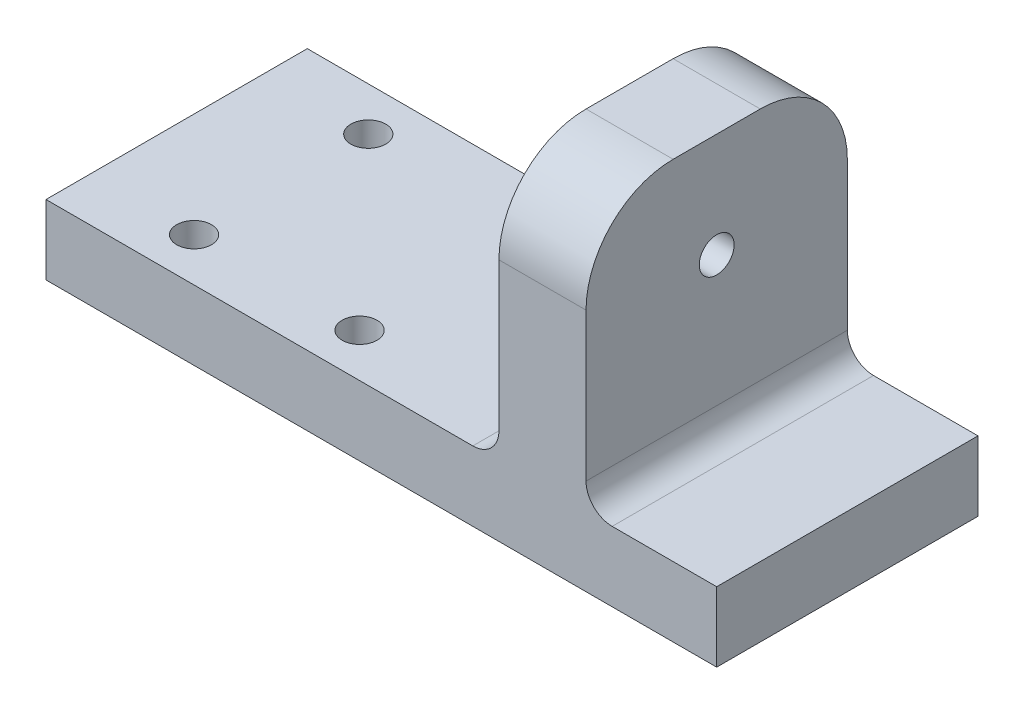
ISO-10303-21;
HEADER;
FILE_DESCRIPTION(('STEP AP214'),'2;1');
FILE_NAME('part.step','',(''),(''),'','','');
FILE_SCHEMA(('AUTOMOTIVE_DESIGN { 1 0 10303 214 1 1 1 1 }'));
ENDSEC;
DATA;
#1=APPLICATION_CONTEXT('core data for automotive mechanical design processes');
#2=APPLICATION_PROTOCOL_DEFINITION('international standard','automotive_design',2000,#1);
#3=PRODUCT_CONTEXT('',#1,'mechanical');
#4=PRODUCT('Part','Part','',(#3));
#5=PRODUCT_RELATED_PRODUCT_CATEGORY('part','',(#4));
#6=PRODUCT_DEFINITION_FORMATION('','',#4);
#7=PRODUCT_DEFINITION_CONTEXT('part definition',#1,'design');
#8=PRODUCT_DEFINITION('design','',#6,#7);
#9=PRODUCT_DEFINITION_SHAPE('','',#8);
#10=(LENGTH_UNIT() NAMED_UNIT(*) SI_UNIT(.MILLI.,.METRE.));
#11=(NAMED_UNIT(*) PLANE_ANGLE_UNIT() SI_UNIT($,.RADIAN.));
#12=(NAMED_UNIT(*) SI_UNIT($,.STERADIAN.) SOLID_ANGLE_UNIT());
#13=UNCERTAINTY_MEASURE_WITH_UNIT(LENGTH_MEASURE(1.E-05),#10,'distance_accuracy_value','');
#14=(GEOMETRIC_REPRESENTATION_CONTEXT(3) GLOBAL_UNCERTAINTY_ASSIGNED_CONTEXT((#13)) GLOBAL_UNIT_ASSIGNED_CONTEXT((#10,
#11,#12)) REPRESENTATION_CONTEXT('',''));
#15=CARTESIAN_POINT('',(0.,0.,0.));
#16=DIRECTION('',(0.,0.,1.));
#17=DIRECTION('',(1.,0.,0.));
#18=AXIS2_PLACEMENT_3D('',#15,#16,#17);
#19=CARTESIAN_POINT('',(0.,8.,0.));
#20=DIRECTION('',(0.,1.,0.));
#21=DIRECTION('',(0.,0.,1.));
#22=AXIS2_PLACEMENT_3D('',#19,#20,#21);
#23=PLANE('',#22);
#24=DIRECTION('',(-1.,0.,0.));
#25=VECTOR('',#24,1.);
#26=CARTESIAN_POINT('',(-20.,8.,-15.));
#27=LINE('',#26,#25);
#28=CARTESIAN_POINT('',(20.,8.,-15.));
#29=VERTEX_POINT('',#28);
#30=CARTESIAN_POINT('',(8.,8.,-15.));
#31=VERTEX_POINT('',#30);
#32=EDGE_CURVE('E205',#29,#31,#27,.T.);
#33=ORIENTED_EDGE('',*,*,#32,.T.);
#34=DIRECTION('',(0.,0.,-1.));
#35=VECTOR('',#34,1.);
#36=CARTESIAN_POINT('',(8.,8.,0.));
#37=LINE('',#36,#35);
#38=CARTESIAN_POINT('',(8.,8.,15.));
#39=VERTEX_POINT('',#38);
#40=EDGE_CURVE('E235',#31,#39,#37,.F.);
#41=ORIENTED_EDGE('',*,*,#40,.T.);
#42=DIRECTION('',(1.,0.,0.));
#43=VECTOR('',#42,1.);
#44=CARTESIAN_POINT('',(-20.,8.,15.));
#45=LINE('',#44,#43);
#46=CARTESIAN_POINT('',(20.,8.,15.));
#47=VERTEX_POINT('',#46);
#48=EDGE_CURVE('E209',#39,#47,#45,.T.);
#49=ORIENTED_EDGE('',*,*,#48,.T.);
#50=DIRECTION('',(0.,0.,-1.));
#51=VECTOR('',#50,1.);
#52=CARTESIAN_POINT('',(20.,8.,-15.));
#53=LINE('',#52,#51);
#54=EDGE_CURVE('E200',#47,#29,#53,.T.);
#55=ORIENTED_EDGE('',*,*,#54,.T.);
#56=EDGE_LOOP('',(#33,#41,#49,#55));
#57=FACE_BOUND('',#56,.T.);
#58=ADVANCED_FACE('F39',(#57),#23,.T.);
#59=CARTESIAN_POINT('',(20.,8.,-15.));
#60=DIRECTION('',(-1.,0.,0.));
#61=DIRECTION('',(0.,0.,1.));
#62=AXIS2_PLACEMENT_3D('',#59,#60,#61);
#63=PLANE('',#62);
#64=DIRECTION('',(0.,0.,-1.));
#65=VECTOR('',#64,1.);
#66=CARTESIAN_POINT('',(20.,0.,-15.));
#67=LINE('',#66,#65);
#68=CARTESIAN_POINT('',(20.,0.,15.));
#69=VERTEX_POINT('',#68);
#70=CARTESIAN_POINT('',(20.,0.,-15.));
#71=VERTEX_POINT('',#70);
#72=EDGE_CURVE('E144',#69,#71,#67,.T.);
#73=ORIENTED_EDGE('',*,*,#72,.T.);
#74=DIRECTION('',(0.,-1.,0.));
#75=VECTOR('',#74,1.);
#76=CARTESIAN_POINT('',(20.,8.,-15.));
#77=LINE('',#76,#75);
#78=EDGE_CURVE('E138',#29,#71,#77,.T.);
#79=ORIENTED_EDGE('',*,*,#78,.F.);
#80=ORIENTED_EDGE('',*,*,#54,.F.);
#81=DIRECTION('',(0.,-1.,0.));
#82=VECTOR('',#81,1.);
#83=CARTESIAN_POINT('',(20.,8.,15.));
#84=LINE('',#83,#82);
#85=EDGE_CURVE('E214',#47,#69,#84,.T.);
#86=ORIENTED_EDGE('',*,*,#85,.T.);
#87=EDGE_LOOP('',(#73,#79,#80,#86));
#88=FACE_BOUND('',#87,.T.);
#89=ADVANCED_FACE('F302',(#88),#63,.F.);
#90=CARTESIAN_POINT('',(-20.,8.,-15.));
#91=DIRECTION('',(0.,0.,1.));
#92=DIRECTION('',(1.,0.,0.));
#93=AXIS2_PLACEMENT_3D('',#90,#91,#92);
#94=PLANE('',#93);
#95=DIRECTION('',(0.,-1.,0.));
#96=VECTOR('',#95,1.);
#97=CARTESIAN_POINT('',(-5.,38.,-15.));
#98=LINE('',#97,#96);
#99=CARTESIAN_POINT('',(-5.,28.,-15.));
#100=VERTEX_POINT('',#99);
#101=CARTESIAN_POINT('',(-5.,11.,-15.));
#102=VERTEX_POINT('',#101);
#103=EDGE_CURVE('E194',#100,#102,#98,.T.);
#104=ORIENTED_EDGE('',*,*,#103,.F.);
#105=DIRECTION('',(-1.,0.,0.));
#106=VECTOR('',#105,1.);
#107=CARTESIAN_POINT('',(5.,28.,-15.));
#108=LINE('',#107,#106);
#109=CARTESIAN_POINT('',(5.,28.,-15.));
#110=VERTEX_POINT('',#109);
#111=EDGE_CURVE('E11',#100,#110,#108,.F.);
#112=ORIENTED_EDGE('',*,*,#111,.T.);
#113=DIRECTION('',(0.,-1.,0.));
#114=VECTOR('',#113,1.);
#115=CARTESIAN_POINT('',(5.,38.,-15.));
#116=LINE('',#115,#114);
#117=CARTESIAN_POINT('',(5.,11.,-15.));
#118=VERTEX_POINT('',#117);
#119=EDGE_CURVE('E197',#110,#118,#116,.T.);
#120=ORIENTED_EDGE('',*,*,#119,.T.);
#121=CARTESIAN_POINT('',(8.,11.,-15.));
#122=DIRECTION('',(0.,0.,1.));
#123=DIRECTION('',(1.,0.,0.));
#124=AXIS2_PLACEMENT_3D('',#121,#122,#123);
#125=CIRCLE('',#124,3.);
#126=EDGE_CURVE('E245',#118,#31,#125,.T.);
#127=ORIENTED_EDGE('',*,*,#126,.T.);
#128=ORIENTED_EDGE('',*,*,#32,.F.);
#129=ORIENTED_EDGE('',*,*,#78,.T.);
#130=DIRECTION('',(-1.,0.,0.));
#131=VECTOR('',#130,1.);
#132=CARTESIAN_POINT('',(-20.,0.,-15.));
#133=LINE('',#132,#131);
#134=CARTESIAN_POINT('',(-57.,0.,-15.));
#135=VERTEX_POINT('',#134);
#136=EDGE_CURVE('E131',#71,#135,#133,.T.);
#137=ORIENTED_EDGE('',*,*,#136,.T.);
#138=DIRECTION('',(0.,-1.,0.));
#139=VECTOR('',#138,1.);
#140=CARTESIAN_POINT('',(-57.,8.,-15.));
#141=LINE('',#140,#139);
#142=CARTESIAN_POINT('',(-57.,8.,-15.));
#143=VERTEX_POINT('',#142);
#144=EDGE_CURVE('E136',#143,#135,#141,.T.);
#145=ORIENTED_EDGE('',*,*,#144,.F.);
#146=CARTESIAN_POINT('',(-8.,8.,-15.));
#147=VERTEX_POINT('',#146);
#148=EDGE_CURVE('E204',#147,#143,#27,.T.);
#149=ORIENTED_EDGE('',*,*,#148,.F.);
#150=CARTESIAN_POINT('',(-8.,11.,-15.));
#151=DIRECTION('',(0.,0.,1.));
#152=DIRECTION('',(1.,0.,0.));
#153=AXIS2_PLACEMENT_3D('',#150,#151,#152);
#154=CIRCLE('',#153,3.);
#155=EDGE_CURVE('E241',#147,#102,#154,.T.);
#156=ORIENTED_EDGE('',*,*,#155,.T.);
#157=EDGE_LOOP('',(#104,#112,#120,#127,#128,#129,#137,#145,#149,#156));
#158=FACE_BOUND('',#157,.T.);
#159=ADVANCED_FACE('F133',(#158),#94,.F.);
#160=CARTESIAN_POINT('',(-20.,8.,15.));
#161=DIRECTION('',(0.,0.,-1.));
#162=DIRECTION('',(-1.,0.,0.));
#163=AXIS2_PLACEMENT_3D('',#160,#161,#162);
#164=PLANE('',#163);
#165=DIRECTION('',(0.,-1.,0.));
#166=VECTOR('',#165,1.);
#167=CARTESIAN_POINT('',(5.,38.,15.));
#168=LINE('',#167,#166);
#169=CARTESIAN_POINT('',(5.,28.,15.));
#170=VERTEX_POINT('',#169);
#171=CARTESIAN_POINT('',(5.,11.,15.));
#172=VERTEX_POINT('',#171);
#173=EDGE_CURVE('E188',#170,#172,#168,.T.);
#174=ORIENTED_EDGE('',*,*,#173,.F.);
#175=DIRECTION('',(1.,0.,0.));
#176=VECTOR('',#175,1.);
#177=CARTESIAN_POINT('',(-5.,28.,15.));
#178=LINE('',#177,#176);
#179=CARTESIAN_POINT('',(-5.,28.,15.));
#180=VERTEX_POINT('',#179);
#181=EDGE_CURVE('E65',#170,#180,#178,.F.);
#182=ORIENTED_EDGE('',*,*,#181,.T.);
#183=DIRECTION('',(0.,-1.,0.));
#184=VECTOR('',#183,1.);
#185=CARTESIAN_POINT('',(-5.,38.,15.));
#186=LINE('',#185,#184);
#187=CARTESIAN_POINT('',(-5.,11.,15.));
#188=VERTEX_POINT('',#187);
#189=EDGE_CURVE('E191',#180,#188,#186,.T.);
#190=ORIENTED_EDGE('',*,*,#189,.T.);
#191=CARTESIAN_POINT('',(-8.,11.,15.));
#192=DIRECTION('',(0.,0.,-1.));
#193=DIRECTION('',(-1.,0.,0.));
#194=AXIS2_PLACEMENT_3D('',#191,#192,#193);
#195=CIRCLE('',#194,3.);
#196=CARTESIAN_POINT('',(-8.,8.,15.));
#197=VERTEX_POINT('',#196);
#198=EDGE_CURVE('E238',#188,#197,#195,.T.);
#199=ORIENTED_EDGE('',*,*,#198,.T.);
#200=CARTESIAN_POINT('',(-57.,8.,15.));
#201=VERTEX_POINT('',#200);
#202=EDGE_CURVE('E210',#201,#197,#45,.T.);
#203=ORIENTED_EDGE('',*,*,#202,.F.);
#204=DIRECTION('',(0.,1.,0.));
#205=VECTOR('',#204,1.);
#206=CARTESIAN_POINT('',(-57.,8.,15.));
#207=LINE('',#206,#205);
#208=CARTESIAN_POINT('',(-57.,0.,15.));
#209=VERTEX_POINT('',#208);
#210=EDGE_CURVE('E153',#209,#201,#207,.T.);
#211=ORIENTED_EDGE('',*,*,#210,.F.);
#212=DIRECTION('',(1.,0.,0.));
#213=VECTOR('',#212,1.);
#214=CARTESIAN_POINT('',(-20.,0.,15.));
#215=LINE('',#214,#213);
#216=EDGE_CURVE('E143',#209,#69,#215,.T.);
#217=ORIENTED_EDGE('',*,*,#216,.T.);
#218=ORIENTED_EDGE('',*,*,#85,.F.);
#219=ORIENTED_EDGE('',*,*,#48,.F.);
#220=CARTESIAN_POINT('',(8.,11.,15.));
#221=DIRECTION('',(0.,0.,-1.));
#222=DIRECTION('',(-1.,0.,0.));
#223=AXIS2_PLACEMENT_3D('',#220,#221,#222);
#224=CIRCLE('',#223,3.);
#225=EDGE_CURVE('E248',#39,#172,#224,.T.);
#226=ORIENTED_EDGE('',*,*,#225,.T.);
#227=EDGE_LOOP('',(#174,#182,#190,#199,#203,#211,#217,#218,#219,#226));
#228=FACE_BOUND('',#227,.T.);
#229=ADVANCED_FACE('F314',(#228),#164,.F.);
#230=CARTESIAN_POINT('',(-26.,8.,-10.));
#231=DIRECTION('',(0.,1.,0.));
#232=DIRECTION('',(0.,0.,-1.));
#233=AXIS2_PLACEMENT_3D('',#230,#231,#232);
#234=CIRCLE('',#233,2.);
#235=CARTESIAN_POINT('',(-26.,8.,-12.));
#236=VERTEX_POINT('',#235);
#237=EDGE_CURVE('E326',#236,#236,#234,.T.);
#238=ORIENTED_EDGE('',*,*,#237,.F.);
#239=EDGE_LOOP('',(#238));
#240=FACE_BOUND('',#239,.T.);
#241=CARTESIAN_POINT('',(-26.,8.,10.));
#242=DIRECTION('',(0.,1.,0.));
#243=DIRECTION('',(0.,0.,1.));
#244=AXIS2_PLACEMENT_3D('',#241,#242,#243);
#245=CIRCLE('',#244,2.);
#246=CARTESIAN_POINT('',(-26.,8.,12.));
#247=VERTEX_POINT('',#246);
#248=EDGE_CURVE('E329',#247,#247,#245,.T.);
#249=ORIENTED_EDGE('',*,*,#248,.F.);
#250=EDGE_LOOP('',(#249));
#251=FACE_BOUND('',#250,.T.);
#252=CARTESIAN_POINT('',(-45.,8.,10.));
#253=DIRECTION('',(0.,1.,0.));
#254=DIRECTION('',(0.,0.,-1.));
#255=AXIS2_PLACEMENT_3D('',#252,#253,#254);
#256=CIRCLE('',#255,2.);
#257=CARTESIAN_POINT('',(-45.,8.,8.));
#258=VERTEX_POINT('',#257);
#259=EDGE_CURVE('E333',#258,#258,#256,.T.);
#260=ORIENTED_EDGE('',*,*,#259,.F.);
#261=EDGE_LOOP('',(#260));
#262=FACE_BOUND('',#261,.T.);
#263=CARTESIAN_POINT('',(-45.,8.,-10.));
#264=DIRECTION('',(0.,1.,0.));
#265=DIRECTION('',(0.,0.,1.));
#266=AXIS2_PLACEMENT_3D('',#263,#264,#265);
#267=CIRCLE('',#266,2.);
#268=CARTESIAN_POINT('',(-45.,8.,-8.));
#269=VERTEX_POINT('',#268);
#270=EDGE_CURVE('E165',#269,#269,#267,.T.);
#271=ORIENTED_EDGE('',*,*,#270,.F.);
#272=EDGE_LOOP('',(#271));
#273=FACE_BOUND('',#272,.T.);
#274=ORIENTED_EDGE('',*,*,#202,.T.);
#275=DIRECTION('',(0.,0.,1.));
#276=VECTOR('',#275,1.);
#277=CARTESIAN_POINT('',(-8.,8.,0.));
#278=LINE('',#277,#276);
#279=EDGE_CURVE('E228',#197,#147,#278,.F.);
#280=ORIENTED_EDGE('',*,*,#279,.T.);
#281=ORIENTED_EDGE('',*,*,#148,.T.);
#282=DIRECTION('',(0.,0.,-1.));
#283=VECTOR('',#282,1.);
#284=CARTESIAN_POINT('',(-57.,8.,-15.));
#285=LINE('',#284,#283);
#286=EDGE_CURVE('E158',#201,#143,#285,.T.);
#287=ORIENTED_EDGE('',*,*,#286,.F.);
#288=EDGE_LOOP('',(#274,#280,#281,#287));
#289=FACE_BOUND('',#288,.T.);
#290=ADVANCED_FACE('F305',(#240,#251,#262,#273,#289),#23,.T.);
#291=CARTESIAN_POINT('',(0.,0.,0.));
#292=DIRECTION('',(0.,1.,0.));
#293=DIRECTION('',(0.,0.,1.));
#294=AXIS2_PLACEMENT_3D('',#291,#292,#293);
#295=PLANE('',#294);
#296=CARTESIAN_POINT('',(-26.,0.,-10.));
#297=DIRECTION('',(0.,1.,0.));
#298=DIRECTION('',(0.,0.,1.));
#299=AXIS2_PLACEMENT_3D('',#296,#297,#298);
#300=CIRCLE('',#299,2.);
#301=CARTESIAN_POINT('',(-26.,0.,-8.));
#302=VERTEX_POINT('',#301);
#303=EDGE_CURVE('E43',#302,#302,#300,.T.);
#304=ORIENTED_EDGE('',*,*,#303,.T.);
#305=EDGE_LOOP('',(#304));
#306=FACE_BOUND('',#305,.T.);
#307=CARTESIAN_POINT('',(-26.,0.,10.));
#308=DIRECTION('',(0.,1.,0.));
#309=DIRECTION('',(0.,0.,1.));
#310=AXIS2_PLACEMENT_3D('',#307,#308,#309);
#311=CIRCLE('',#310,2.);
#312=CARTESIAN_POINT('',(-26.,0.,12.));
#313=VERTEX_POINT('',#312);
#314=EDGE_CURVE('E163',#313,#313,#311,.T.);
#315=ORIENTED_EDGE('',*,*,#314,.T.);
#316=EDGE_LOOP('',(#315));
#317=FACE_BOUND('',#316,.T.);
#318=CARTESIAN_POINT('',(-45.,0.,10.));
#319=DIRECTION('',(0.,1.,0.));
#320=DIRECTION('',(0.,0.,1.));
#321=AXIS2_PLACEMENT_3D('',#318,#319,#320);
#322=CIRCLE('',#321,2.);
#323=CARTESIAN_POINT('',(-45.,0.,12.));
#324=VERTEX_POINT('',#323);
#325=EDGE_CURVE('E276',#324,#324,#322,.T.);
#326=ORIENTED_EDGE('',*,*,#325,.T.);
#327=EDGE_LOOP('',(#326));
#328=FACE_BOUND('',#327,.T.);
#329=CARTESIAN_POINT('',(-45.,0.,-10.));
#330=DIRECTION('',(0.,1.,0.));
#331=DIRECTION('',(0.,0.,1.));
#332=AXIS2_PLACEMENT_3D('',#329,#330,#331);
#333=CIRCLE('',#332,2.);
#334=CARTESIAN_POINT('',(-45.,0.,-8.));
#335=VERTEX_POINT('',#334);
#336=EDGE_CURVE('E272',#335,#335,#333,.T.);
#337=ORIENTED_EDGE('',*,*,#336,.T.);
#338=EDGE_LOOP('',(#337));
#339=FACE_BOUND('',#338,.T.);
#340=ORIENTED_EDGE('',*,*,#72,.F.);
#341=ORIENTED_EDGE('',*,*,#216,.F.);
#342=DIRECTION('',(0.,0.,1.));
#343=VECTOR('',#342,1.);
#344=CARTESIAN_POINT('',(-57.,0.,-15.));
#345=LINE('',#344,#343);
#346=EDGE_CURVE('E147',#135,#209,#345,.T.);
#347=ORIENTED_EDGE('',*,*,#346,.F.);
#348=ORIENTED_EDGE('',*,*,#136,.F.);
#349=EDGE_LOOP('',(#340,#341,#347,#348));
#350=FACE_BOUND('',#349,.T.);
#351=ADVANCED_FACE('F148',(#306,#317,#328,#339,#350),#295,.F.);
#352=CARTESIAN_POINT('',(5.,38.,-15.));
#353=DIRECTION('',(-1.,0.,0.));
#354=DIRECTION('',(0.,0.,1.));
#355=AXIS2_PLACEMENT_3D('',#352,#353,#354);
#356=PLANE('',#355);
#357=CARTESIAN_POINT('',(5.,26.,0.));
#358=DIRECTION('',(1.,0.,0.));
#359=DIRECTION('',(0.,0.,-1.));
#360=AXIS2_PLACEMENT_3D('',#357,#358,#359);
#361=CIRCLE('',#360,2.);
#362=CARTESIAN_POINT('',(5.,26.,-2.));
#363=VERTEX_POINT('',#362);
#364=EDGE_CURVE('E172',#363,#363,#361,.T.);
#365=ORIENTED_EDGE('',*,*,#364,.F.);
#366=EDGE_LOOP('',(#365));
#367=FACE_BOUND('',#366,.T.);
#368=DIRECTION('',(0.,0.,-1.));
#369=VECTOR('',#368,1.);
#370=CARTESIAN_POINT('',(5.,38.,-15.));
#371=LINE('',#370,#369);
#372=CARTESIAN_POINT('',(5.,38.,4.99999999999999));
#373=VERTEX_POINT('',#372);
#374=CARTESIAN_POINT('',(5.,38.,-5.00000000000001));
#375=VERTEX_POINT('',#374);
#376=EDGE_CURVE('E177',#373,#375,#371,.T.);
#377=ORIENTED_EDGE('',*,*,#376,.F.);
#378=CARTESIAN_POINT('',(5.,28.,4.99999999999999));
#379=DIRECTION('',(-1.,0.,0.));
#380=DIRECTION('',(0.,0.,1.));
#381=AXIS2_PLACEMENT_3D('',#378,#379,#380);
#382=CIRCLE('',#381,10.);
#383=EDGE_CURVE('E263',#373,#170,#382,.F.);
#384=ORIENTED_EDGE('',*,*,#383,.T.);
#385=ORIENTED_EDGE('',*,*,#173,.T.);
#386=DIRECTION('',(0.,0.,-1.));
#387=VECTOR('',#386,1.);
#388=CARTESIAN_POINT('',(5.,11.,-15.));
#389=LINE('',#388,#387);
#390=EDGE_CURVE('E231',#172,#118,#389,.T.);
#391=ORIENTED_EDGE('',*,*,#390,.T.);
#392=ORIENTED_EDGE('',*,*,#119,.F.);
#393=CARTESIAN_POINT('',(5.,28.,-5.));
#394=DIRECTION('',(-1.,0.,0.));
#395=DIRECTION('',(0.,0.,1.));
#396=AXIS2_PLACEMENT_3D('',#393,#394,#395);
#397=CIRCLE('',#396,10.);
#398=EDGE_CURVE('E260',#110,#375,#397,.F.);
#399=ORIENTED_EDGE('',*,*,#398,.T.);
#400=EDGE_LOOP('',(#377,#384,#385,#391,#392,#399));
#401=FACE_BOUND('',#400,.T.);
#402=ADVANCED_FACE('F320',(#367,#401),#356,.F.);
#403=CARTESIAN_POINT('',(-5.,38.,-15.));
#404=DIRECTION('',(1.,0.,0.));
#405=DIRECTION('',(0.,0.,-1.));
#406=AXIS2_PLACEMENT_3D('',#403,#404,#405);
#407=PLANE('',#406);
#408=CARTESIAN_POINT('',(-5.,26.,0.));
#409=DIRECTION('',(1.,0.,0.));
#410=DIRECTION('',(0.,0.,-1.));
#411=AXIS2_PLACEMENT_3D('',#408,#409,#410);
#412=CIRCLE('',#411,2.);
#413=CARTESIAN_POINT('',(-5.,26.,-2.));
#414=VERTEX_POINT('',#413);
#415=EDGE_CURVE('E173',#414,#414,#412,.T.);
#416=ORIENTED_EDGE('',*,*,#415,.T.);
#417=EDGE_LOOP('',(#416));
#418=FACE_BOUND('',#417,.T.);
#419=ORIENTED_EDGE('',*,*,#189,.F.);
#420=CARTESIAN_POINT('',(-5.,28.,4.99999999999999));
#421=DIRECTION('',(1.,0.,0.));
#422=DIRECTION('',(0.,0.,-1.));
#423=AXIS2_PLACEMENT_3D('',#420,#421,#422);
#424=CIRCLE('',#423,10.);
#425=CARTESIAN_POINT('',(-5.,38.,4.99999999999999));
#426=VERTEX_POINT('',#425);
#427=EDGE_CURVE('E49',#180,#426,#424,.F.);
#428=ORIENTED_EDGE('',*,*,#427,.T.);
#429=DIRECTION('',(0.,0.,1.));
#430=VECTOR('',#429,1.);
#431=CARTESIAN_POINT('',(-5.,38.,-15.));
#432=LINE('',#431,#430);
#433=CARTESIAN_POINT('',(-5.,38.,-5.00000000000001));
#434=VERTEX_POINT('',#433);
#435=EDGE_CURVE('E184',#434,#426,#432,.T.);
#436=ORIENTED_EDGE('',*,*,#435,.F.);
#437=CARTESIAN_POINT('',(-5.,28.,-5.));
#438=DIRECTION('',(1.,0.,0.));
#439=DIRECTION('',(0.,0.,-1.));
#440=AXIS2_PLACEMENT_3D('',#437,#438,#439);
#441=CIRCLE('',#440,10.);
#442=EDGE_CURVE('E57',#434,#100,#441,.F.);
#443=ORIENTED_EDGE('',*,*,#442,.T.);
#444=ORIENTED_EDGE('',*,*,#103,.T.);
#445=DIRECTION('',(0.,0.,1.));
#446=VECTOR('',#445,1.);
#447=CARTESIAN_POINT('',(-5.,11.,-15.));
#448=LINE('',#447,#446);
#449=EDGE_CURVE('E224',#102,#188,#448,.T.);
#450=ORIENTED_EDGE('',*,*,#449,.T.);
#451=EDGE_LOOP('',(#419,#428,#436,#443,#444,#450));
#452=FACE_BOUND('',#451,.T.);
#453=ADVANCED_FACE('F357',(#418,#452),#407,.F.);
#454=CARTESIAN_POINT('',(0.,38.,0.));
#455=DIRECTION('',(0.,1.,0.));
#456=DIRECTION('',(0.,0.,1.));
#457=AXIS2_PLACEMENT_3D('',#454,#455,#456);
#458=PLANE('',#457);
#459=ORIENTED_EDGE('',*,*,#435,.T.);
#460=DIRECTION('',(1.,0.,0.));
#461=VECTOR('',#460,1.);
#462=CARTESIAN_POINT('',(5.,38.,4.99999999999999));
#463=LINE('',#462,#461);
#464=EDGE_CURVE('E256',#426,#373,#463,.T.);
#465=ORIENTED_EDGE('',*,*,#464,.T.);
#466=ORIENTED_EDGE('',*,*,#376,.T.);
#467=DIRECTION('',(-1.,0.,0.));
#468=VECTOR('',#467,1.);
#469=CARTESIAN_POINT('',(-5.,38.,-5.));
#470=LINE('',#469,#468);
#471=EDGE_CURVE('E252',#375,#434,#470,.T.);
#472=ORIENTED_EDGE('',*,*,#471,.T.);
#473=EDGE_LOOP('',(#459,#465,#466,#472));
#474=FACE_BOUND('',#473,.T.);
#475=ADVANCED_FACE('F359',(#474),#458,.T.);
#476=CARTESIAN_POINT('',(-8.,11.,-15.));
#477=DIRECTION('',(0.,0.,1.));
#478=DIRECTION('',(1.,0.,0.));
#479=AXIS2_PLACEMENT_3D('',#476,#477,#478);
#480=CYLINDRICAL_SURFACE('',#479,3.);
#481=ORIENTED_EDGE('',*,*,#155,.F.);
#482=ORIENTED_EDGE('',*,*,#279,.F.);
#483=ORIENTED_EDGE('',*,*,#198,.F.);
#484=ORIENTED_EDGE('',*,*,#449,.F.);
#485=EDGE_LOOP('',(#481,#482,#483,#484));
#486=FACE_BOUND('',#485,.T.);
#487=ADVANCED_FACE('F341',(#486),#480,.F.);
#488=CARTESIAN_POINT('',(8.,11.,-15.));
#489=DIRECTION('',(0.,0.,-1.));
#490=DIRECTION('',(-1.,0.,0.));
#491=AXIS2_PLACEMENT_3D('',#488,#489,#490);
#492=CYLINDRICAL_SURFACE('',#491,3.);
#493=ORIENTED_EDGE('',*,*,#225,.F.);
#494=ORIENTED_EDGE('',*,*,#40,.F.);
#495=ORIENTED_EDGE('',*,*,#126,.F.);
#496=ORIENTED_EDGE('',*,*,#390,.F.);
#497=EDGE_LOOP('',(#493,#494,#495,#496));
#498=FACE_BOUND('',#497,.T.);
#499=ADVANCED_FACE('F367',(#498),#492,.F.);
#500=CARTESIAN_POINT('',(-5.,26.,0.));
#501=DIRECTION('',(1.,0.,0.));
#502=DIRECTION('',(0.,0.,-1.));
#503=AXIS2_PLACEMENT_3D('',#500,#501,#502);
#504=CYLINDRICAL_SURFACE('',#503,2.);
#505=ORIENTED_EDGE('',*,*,#415,.F.);
#506=EDGE_LOOP('',(#505));
#507=FACE_BOUND('',#506,.T.);
#508=ORIENTED_EDGE('',*,*,#364,.T.);
#509=EDGE_LOOP('',(#508));
#510=FACE_BOUND('',#509,.T.);
#511=ADVANCED_FACE('F369',(#507,#510),#504,.F.);
#512=CARTESIAN_POINT('',(0.,28.,4.99999999999999));
#513=DIRECTION('',(-1.,0.,0.));
#514=DIRECTION('',(0.,0.,1.));
#515=AXIS2_PLACEMENT_3D('',#512,#513,#514);
#516=CYLINDRICAL_SURFACE('',#515,10.);
#517=ORIENTED_EDGE('',*,*,#427,.F.);
#518=ORIENTED_EDGE('',*,*,#181,.F.);
#519=ORIENTED_EDGE('',*,*,#383,.F.);
#520=ORIENTED_EDGE('',*,*,#464,.F.);
#521=EDGE_LOOP('',(#517,#518,#519,#520));
#522=FACE_BOUND('',#521,.T.);
#523=ADVANCED_FACE('F355',(#522),#516,.T.);
#524=CARTESIAN_POINT('',(0.,28.,-5.));
#525=DIRECTION('',(1.,0.,0.));
#526=DIRECTION('',(0.,0.,-1.));
#527=AXIS2_PLACEMENT_3D('',#524,#525,#526);
#528=CYLINDRICAL_SURFACE('',#527,10.);
#529=ORIENTED_EDGE('',*,*,#398,.F.);
#530=ORIENTED_EDGE('',*,*,#111,.F.);
#531=ORIENTED_EDGE('',*,*,#442,.F.);
#532=ORIENTED_EDGE('',*,*,#471,.F.);
#533=EDGE_LOOP('',(#529,#530,#531,#532));
#534=FACE_BOUND('',#533,.T.);
#535=ADVANCED_FACE('F41',(#534),#528,.T.);
#536=CARTESIAN_POINT('',(-57.,0.,0.));
#537=DIRECTION('',(-1.,0.,0.));
#538=DIRECTION('',(0.,0.,1.));
#539=AXIS2_PLACEMENT_3D('',#536,#537,#538);
#540=PLANE('',#539);
#541=ORIENTED_EDGE('',*,*,#144,.T.);
#542=ORIENTED_EDGE('',*,*,#346,.T.);
#543=ORIENTED_EDGE('',*,*,#210,.T.);
#544=ORIENTED_EDGE('',*,*,#286,.T.);
#545=EDGE_LOOP('',(#541,#542,#543,#544));
#546=FACE_BOUND('',#545,.T.);
#547=ADVANCED_FACE('F156',(#546),#540,.T.);
#548=CARTESIAN_POINT('',(-45.,-29.,-10.));
#549=DIRECTION('',(0.,1.,0.));
#550=DIRECTION('',(0.,0.,1.));
#551=AXIS2_PLACEMENT_3D('',#548,#549,#550);
#552=CYLINDRICAL_SURFACE('',#551,2.);
#553=ORIENTED_EDGE('',*,*,#270,.T.);
#554=EDGE_LOOP('',(#553));
#555=FACE_BOUND('',#554,.T.);
#556=ORIENTED_EDGE('',*,*,#336,.F.);
#557=EDGE_LOOP('',(#556));
#558=FACE_BOUND('',#557,.T.);
#559=ADVANCED_FACE('F297',(#555,#558),#552,.F.);
#560=CARTESIAN_POINT('',(-45.,-29.,10.));
#561=DIRECTION('',(0.,1.,0.));
#562=DIRECTION('',(0.,0.,1.));
#563=AXIS2_PLACEMENT_3D('',#560,#561,#562);
#564=CYLINDRICAL_SURFACE('',#563,2.);
#565=ORIENTED_EDGE('',*,*,#259,.T.);
#566=EDGE_LOOP('',(#565));
#567=FACE_BOUND('',#566,.T.);
#568=ORIENTED_EDGE('',*,*,#325,.F.);
#569=EDGE_LOOP('',(#568));
#570=FACE_BOUND('',#569,.T.);
#571=ADVANCED_FACE('F288',(#567,#570),#564,.F.);
#572=CARTESIAN_POINT('',(-26.,-29.,10.));
#573=DIRECTION('',(0.,1.,0.));
#574=DIRECTION('',(0.,0.,1.));
#575=AXIS2_PLACEMENT_3D('',#572,#573,#574);
#576=CYLINDRICAL_SURFACE('',#575,2.);
#577=ORIENTED_EDGE('',*,*,#248,.T.);
#578=EDGE_LOOP('',(#577));
#579=FACE_BOUND('',#578,.T.);
#580=ORIENTED_EDGE('',*,*,#314,.F.);
#581=EDGE_LOOP('',(#580));
#582=FACE_BOUND('',#581,.T.);
#583=ADVANCED_FACE('F285',(#579,#582),#576,.F.);
#584=CARTESIAN_POINT('',(-26.,-29.,-10.));
#585=DIRECTION('',(0.,1.,0.));
#586=DIRECTION('',(0.,0.,1.));
#587=AXIS2_PLACEMENT_3D('',#584,#585,#586);
#588=CYLINDRICAL_SURFACE('',#587,2.);
#589=ORIENTED_EDGE('',*,*,#237,.T.);
#590=EDGE_LOOP('',(#589));
#591=FACE_BOUND('',#590,.T.);
#592=ORIENTED_EDGE('',*,*,#303,.F.);
#593=EDGE_LOOP('',(#592));
#594=FACE_BOUND('',#593,.T.);
#595=ADVANCED_FACE('F287',(#591,#594),#588,.F.);
#596=CLOSED_SHELL('',(#58,#89,#159,#229,#290,#351,#402,#453,#475,#487,#499,#511,#523,#535,#547,
#559,#571,#583,#595));
#597=MANIFOLD_SOLID_BREP('B2',#596);
#598=ADVANCED_BREP_SHAPE_REPRESENTATION('',(#18,#597),#14);
#599=SHAPE_DEFINITION_REPRESENTATION(#9,#598);
ENDSEC;
END-ISO-10303-21;
